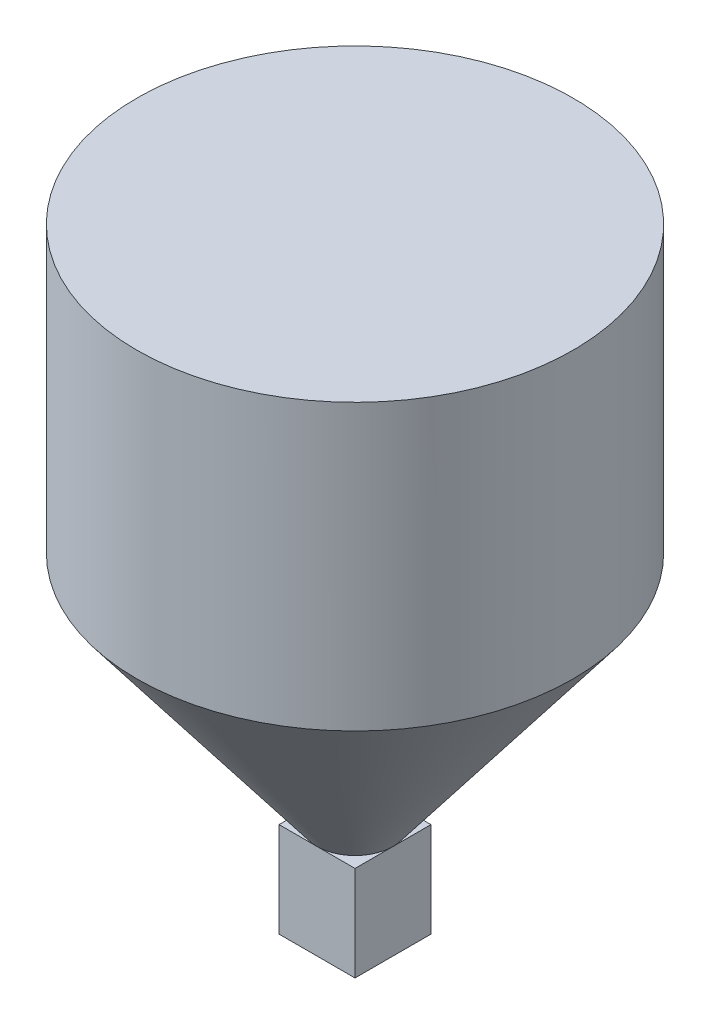
ISO-10303-21;
HEADER;
FILE_DESCRIPTION(('STEP AP214'),'2;1');
FILE_NAME('part.step','',(''),(''),'','','');
FILE_SCHEMA(('AUTOMOTIVE_DESIGN { 1 0 10303 214 1 1 1 1 }'));
ENDSEC;
DATA;
#1=APPLICATION_CONTEXT('core data for automotive mechanical design processes');
#2=APPLICATION_PROTOCOL_DEFINITION('international standard','automotive_design',2000,#1);
#3=PRODUCT_CONTEXT('',#1,'mechanical');
#4=PRODUCT('Part','Part','',(#3));
#5=PRODUCT_RELATED_PRODUCT_CATEGORY('part','',(#4));
#6=PRODUCT_DEFINITION_FORMATION('','',#4);
#7=PRODUCT_DEFINITION_CONTEXT('part definition',#1,'design');
#8=PRODUCT_DEFINITION('design','',#6,#7);
#9=PRODUCT_DEFINITION_SHAPE('','',#8);
#10=(LENGTH_UNIT() NAMED_UNIT(*) SI_UNIT(.MILLI.,.METRE.));
#11=(NAMED_UNIT(*) PLANE_ANGLE_UNIT() SI_UNIT($,.RADIAN.));
#12=(NAMED_UNIT(*) SI_UNIT($,.STERADIAN.) SOLID_ANGLE_UNIT());
#13=UNCERTAINTY_MEASURE_WITH_UNIT(LENGTH_MEASURE(1.E-05),#10,'distance_accuracy_value','');
#14=(GEOMETRIC_REPRESENTATION_CONTEXT(3) GLOBAL_UNCERTAINTY_ASSIGNED_CONTEXT((#13)) GLOBAL_UNIT_ASSIGNED_CONTEXT((#10,
#11,#12)) REPRESENTATION_CONTEXT('',''));
#15=CARTESIAN_POINT('',(0.,0.,0.));
#16=DIRECTION('',(0.,0.,1.));
#17=DIRECTION('',(1.,0.,0.));
#18=AXIS2_PLACEMENT_3D('',#15,#16,#17);
#19=CARTESIAN_POINT('',(0.,-150.,0.));
#20=DIRECTION('',(0.,1.,0.));
#21=DIRECTION('',(0.,0.,1.));
#22=AXIS2_PLACEMENT_3D('',#19,#20,#21);
#23=CYLINDRICAL_SURFACE('',#22,115.);
#24=CARTESIAN_POINT('',(0.,-150.,0.));
#25=DIRECTION('',(0.,-1.,0.));
#26=DIRECTION('',(0.,0.,-1.));
#27=AXIS2_PLACEMENT_3D('',#24,#25,#26);
#28=CIRCLE('',#27,115.);
#29=CARTESIAN_POINT('',(0.,-150.,-115.));
#30=VERTEX_POINT('',#29);
#31=EDGE_CURVE('E45',#30,#30,#28,.T.);
#32=ORIENTED_EDGE('',*,*,#31,.F.);
#33=EDGE_LOOP('',(#32));
#34=FACE_BOUND('',#33,.T.);
#35=CARTESIAN_POINT('',(0.,0.,0.));
#36=DIRECTION('',(0.,1.,0.));
#37=DIRECTION('',(0.,0.,1.));
#38=AXIS2_PLACEMENT_3D('',#35,#36,#37);
#39=CIRCLE('',#38,115.);
#40=CARTESIAN_POINT('',(0.,0.,115.));
#41=VERTEX_POINT('',#40);
#42=EDGE_CURVE('E12',#41,#41,#39,.T.);
#43=ORIENTED_EDGE('',*,*,#42,.F.);
#44=EDGE_LOOP('',(#43));
#45=FACE_BOUND('',#44,.T.);
#46=ADVANCED_FACE('F36',(#34,#45),#23,.T.);
#47=CARTESIAN_POINT('',(0.,0.,0.));
#48=DIRECTION('',(0.,1.,0.));
#49=DIRECTION('',(0.,0.,1.));
#50=AXIS2_PLACEMENT_3D('',#47,#48,#49);
#51=PLANE('',#50);
#52=ORIENTED_EDGE('',*,*,#42,.T.);
#53=EDGE_LOOP('',(#52));
#54=FACE_BOUND('',#53,.T.);
#55=ADVANCED_FACE('F211',(#54),#51,.T.);
#56=CARTESIAN_POINT('',(0.,-274.,0.));
#57=DIRECTION('',(0.,1.,0.));
#58=DIRECTION('',(0.,0.,1.));
#59=AXIS2_PLACEMENT_3D('',#56,#57,#58);
#60=CONICAL_SURFACE('',#59,20.,0.65374402840699);
#61=CARTESIAN_POINT('',(0.,-274.,0.));
#62=DIRECTION('',(0.,1.,0.));
#63=DIRECTION('',(0.,0.,1.));
#64=AXIS2_PLACEMENT_3D('',#61,#62,#63);
#65=CIRCLE('',#64,20.);
#66=CARTESIAN_POINT('',(0.,-274.,20.));
#67=VERTEX_POINT('',#66);
#68=CARTESIAN_POINT('',(20.0000000000104,-274.,0.000548485205833332));
#69=VERTEX_POINT('',#68);
#70=EDGE_CURVE('E60',#67,#69,#65,.T.);
#71=ORIENTED_EDGE('',*,*,#70,.T.);
#72=CARTESIAN_POINT('',(0.000548485206326027,-274.,-20.));
#73=VERTEX_POINT('',#72);
#74=EDGE_CURVE('E39',#69,#73,#65,.T.);
#75=ORIENTED_EDGE('',*,*,#74,.T.);
#76=CARTESIAN_POINT('',(-20.,-274.,-0.000548485206319088));
#77=VERTEX_POINT('',#76);
#78=EDGE_CURVE('E119',#73,#77,#65,.T.);
#79=ORIENTED_EDGE('',*,*,#78,.T.);
#80=EDGE_CURVE('E116',#77,#67,#65,.T.);
#81=ORIENTED_EDGE('',*,*,#80,.T.);
#82=EDGE_LOOP('',(#71,#75,#79,#81));
#83=FACE_BOUND('',#82,.T.);
#84=ORIENTED_EDGE('',*,*,#31,.T.);
#85=EDGE_LOOP('',(#84));
#86=FACE_BOUND('',#85,.T.);
#87=ADVANCED_FACE('F202',(#83,#86),#60,.T.);
#88=CARTESIAN_POINT('',(0.,-274.,0.));
#89=DIRECTION('',(0.,1.,0.));
#90=DIRECTION('',(0.,0.,1.));
#91=AXIS2_PLACEMENT_3D('',#88,#89,#90);
#92=PLANE('',#91);
#93=DIRECTION('',(-1.,0.,0.));
#94=VECTOR('',#93,1.);
#95=CARTESIAN_POINT('',(-20.,-274.,20.));
#96=LINE('',#95,#94);
#97=CARTESIAN_POINT('',(-20.,-274.,20.));
#98=VERTEX_POINT('',#97);
#99=EDGE_CURVE('E139',#67,#98,#96,.T.);
#100=ORIENTED_EDGE('',*,*,#99,.F.);
#101=ORIENTED_EDGE('',*,*,#80,.F.);
#102=DIRECTION('',(0.,0.,-1.));
#103=VECTOR('',#102,1.);
#104=CARTESIAN_POINT('',(-20.,-274.,-20.));
#105=LINE('',#104,#103);
#106=EDGE_CURVE('E240',#98,#77,#105,.T.);
#107=ORIENTED_EDGE('',*,*,#106,.F.);
#108=EDGE_LOOP('',(#100,#101,#107));
#109=FACE_BOUND('',#108,.T.);
#110=ADVANCED_FACE('F161',(#109),#92,.T.);
#111=CARTESIAN_POINT('',(-20.,-274.,-20.));
#112=VERTEX_POINT('',#111);
#113=EDGE_CURVE('E143',#77,#112,#105,.T.);
#114=ORIENTED_EDGE('',*,*,#113,.F.);
#115=ORIENTED_EDGE('',*,*,#78,.F.);
#116=DIRECTION('',(1.,0.,0.));
#117=VECTOR('',#116,1.);
#118=CARTESIAN_POINT('',(-20.,-274.,-20.));
#119=LINE('',#118,#117);
#120=EDGE_CURVE('E112',#112,#73,#119,.T.);
#121=ORIENTED_EDGE('',*,*,#120,.F.);
#122=EDGE_LOOP('',(#114,#115,#121));
#123=FACE_BOUND('',#122,.T.);
#124=ADVANCED_FACE('F234',(#123),#92,.T.);
#125=CARTESIAN_POINT('',(20.,-274.,-20.));
#126=VERTEX_POINT('',#125);
#127=EDGE_CURVE('E238',#73,#126,#119,.T.);
#128=ORIENTED_EDGE('',*,*,#127,.F.);
#129=ORIENTED_EDGE('',*,*,#74,.F.);
#130=DIRECTION('',(0.,0.,1.));
#131=VECTOR('',#130,1.);
#132=CARTESIAN_POINT('',(20.,-274.,-20.));
#133=LINE('',#132,#131);
#134=EDGE_CURVE('E53',#126,#69,#133,.T.);
#135=ORIENTED_EDGE('',*,*,#134,.F.);
#136=EDGE_LOOP('',(#128,#129,#135));
#137=FACE_BOUND('',#136,.T.);
#138=ADVANCED_FACE('F162',(#137),#92,.T.);
#139=CARTESIAN_POINT('',(20.,-324.,-20.));
#140=DIRECTION('',(-1.,0.,0.));
#141=DIRECTION('',(0.,0.,1.));
#142=AXIS2_PLACEMENT_3D('',#139,#140,#141);
#143=PLANE('',#142);
#144=ORIENTED_EDGE('',*,*,#134,.T.);
#145=CARTESIAN_POINT('',(20.,-274.,20.));
#146=VERTEX_POINT('',#145);
#147=EDGE_CURVE('E115',#69,#146,#133,.T.);
#148=ORIENTED_EDGE('',*,*,#147,.T.);
#149=DIRECTION('',(0.,1.,0.));
#150=VECTOR('',#149,1.);
#151=CARTESIAN_POINT('',(20.,-324.,20.));
#152=LINE('',#151,#150);
#153=CARTESIAN_POINT('',(20.,-324.,20.));
#154=VERTEX_POINT('',#153);
#155=EDGE_CURVE('E99',#154,#146,#152,.T.);
#156=ORIENTED_EDGE('',*,*,#155,.F.);
#157=DIRECTION('',(0.,0.,1.));
#158=VECTOR('',#157,1.);
#159=CARTESIAN_POINT('',(20.,-324.,-20.));
#160=LINE('',#159,#158);
#161=CARTESIAN_POINT('',(20.,-324.,-20.));
#162=VERTEX_POINT('',#161);
#163=EDGE_CURVE('E105',#162,#154,#160,.T.);
#164=ORIENTED_EDGE('',*,*,#163,.F.);
#165=DIRECTION('',(0.,1.,0.));
#166=VECTOR('',#165,1.);
#167=CARTESIAN_POINT('',(20.,-324.,-20.));
#168=LINE('',#167,#166);
#169=EDGE_CURVE('E247',#162,#126,#168,.T.);
#170=ORIENTED_EDGE('',*,*,#169,.T.);
#171=EDGE_LOOP('',(#144,#148,#156,#164,#170));
#172=FACE_BOUND('',#171,.T.);
#173=ADVANCED_FACE('F114',(#172),#143,.F.);
#174=CARTESIAN_POINT('',(-20.,-324.,20.));
#175=DIRECTION('',(0.,0.,-1.));
#176=DIRECTION('',(-1.,0.,0.));
#177=AXIS2_PLACEMENT_3D('',#174,#175,#176);
#178=PLANE('',#177);
#179=EDGE_CURVE('E142',#146,#67,#96,.T.);
#180=ORIENTED_EDGE('',*,*,#179,.T.);
#181=ORIENTED_EDGE('',*,*,#99,.T.);
#182=DIRECTION('',(0.,1.,0.));
#183=VECTOR('',#182,1.);
#184=CARTESIAN_POINT('',(-20.,-324.,20.));
#185=LINE('',#184,#183);
#186=CARTESIAN_POINT('',(-20.,-324.,20.));
#187=VERTEX_POINT('',#186);
#188=EDGE_CURVE('E101',#187,#98,#185,.T.);
#189=ORIENTED_EDGE('',*,*,#188,.F.);
#190=DIRECTION('',(-1.,0.,0.));
#191=VECTOR('',#190,1.);
#192=CARTESIAN_POINT('',(-20.,-324.,20.));
#193=LINE('',#192,#191);
#194=EDGE_CURVE('E94',#154,#187,#193,.T.);
#195=ORIENTED_EDGE('',*,*,#194,.F.);
#196=ORIENTED_EDGE('',*,*,#155,.T.);
#197=EDGE_LOOP('',(#180,#181,#189,#195,#196));
#198=FACE_BOUND('',#197,.T.);
#199=ADVANCED_FACE('F97',(#198),#178,.F.);
#200=CARTESIAN_POINT('',(-20.,-324.,-20.));
#201=DIRECTION('',(1.,0.,0.));
#202=DIRECTION('',(0.,0.,-1.));
#203=AXIS2_PLACEMENT_3D('',#200,#201,#202);
#204=PLANE('',#203);
#205=ORIENTED_EDGE('',*,*,#106,.T.);
#206=ORIENTED_EDGE('',*,*,#113,.T.);
#207=DIRECTION('',(0.,1.,0.));
#208=VECTOR('',#207,1.);
#209=CARTESIAN_POINT('',(-20.,-324.,-20.));
#210=LINE('',#209,#208);
#211=CARTESIAN_POINT('',(-20.,-324.,-20.));
#212=VERTEX_POINT('',#211);
#213=EDGE_CURVE('E121',#212,#112,#210,.T.);
#214=ORIENTED_EDGE('',*,*,#213,.F.);
#215=DIRECTION('',(0.,0.,-1.));
#216=VECTOR('',#215,1.);
#217=CARTESIAN_POINT('',(-20.,-324.,-20.));
#218=LINE('',#217,#216);
#219=EDGE_CURVE('E104',#187,#212,#218,.T.);
#220=ORIENTED_EDGE('',*,*,#219,.F.);
#221=ORIENTED_EDGE('',*,*,#188,.T.);
#222=EDGE_LOOP('',(#205,#206,#214,#220,#221));
#223=FACE_BOUND('',#222,.T.);
#224=ADVANCED_FACE('F250',(#223),#204,.F.);
#225=CARTESIAN_POINT('',(-20.,-324.,-20.));
#226=DIRECTION('',(0.,0.,1.));
#227=DIRECTION('',(1.,0.,0.));
#228=AXIS2_PLACEMENT_3D('',#225,#226,#227);
#229=PLANE('',#228);
#230=ORIENTED_EDGE('',*,*,#120,.T.);
#231=ORIENTED_EDGE('',*,*,#127,.T.);
#232=ORIENTED_EDGE('',*,*,#169,.F.);
#233=DIRECTION('',(1.,0.,0.));
#234=VECTOR('',#233,1.);
#235=CARTESIAN_POINT('',(-20.,-324.,-20.));
#236=LINE('',#235,#234);
#237=EDGE_CURVE('E110',#212,#162,#236,.T.);
#238=ORIENTED_EDGE('',*,*,#237,.F.);
#239=ORIENTED_EDGE('',*,*,#213,.T.);
#240=EDGE_LOOP('',(#230,#231,#232,#238,#239));
#241=FACE_BOUND('',#240,.T.);
#242=ADVANCED_FACE('F163',(#241),#229,.F.);
#243=CARTESIAN_POINT('',(0.,-324.,0.));
#244=DIRECTION('',(0.,1.,0.));
#245=DIRECTION('',(0.,0.,1.));
#246=AXIS2_PLACEMENT_3D('',#243,#244,#245);
#247=PLANE('',#246);
#248=ORIENTED_EDGE('',*,*,#163,.T.);
#249=ORIENTED_EDGE('',*,*,#194,.T.);
#250=ORIENTED_EDGE('',*,*,#219,.T.);
#251=ORIENTED_EDGE('',*,*,#237,.T.);
#252=EDGE_LOOP('',(#248,#249,#250,#251));
#253=FACE_BOUND('',#252,.T.);
#254=ADVANCED_FACE('F108',(#253),#247,.F.);
#255=ORIENTED_EDGE('',*,*,#147,.F.);
#256=ORIENTED_EDGE('',*,*,#70,.F.);
#257=ORIENTED_EDGE('',*,*,#179,.F.);
#258=EDGE_LOOP('',(#255,#256,#257));
#259=FACE_BOUND('',#258,.T.);
#260=ADVANCED_FACE('F151',(#259),#92,.T.);
#261=CLOSED_SHELL('',(#46,#55,#87,#110,#124,#138,#173,#199,#224,#242,#254,#260));
#262=MANIFOLD_SOLID_BREP('B2',#261);
#263=ADVANCED_BREP_SHAPE_REPRESENTATION('',(#18,#262),#14);
#264=SHAPE_DEFINITION_REPRESENTATION(#9,#263);
ENDSEC;
END-ISO-10303-21;
